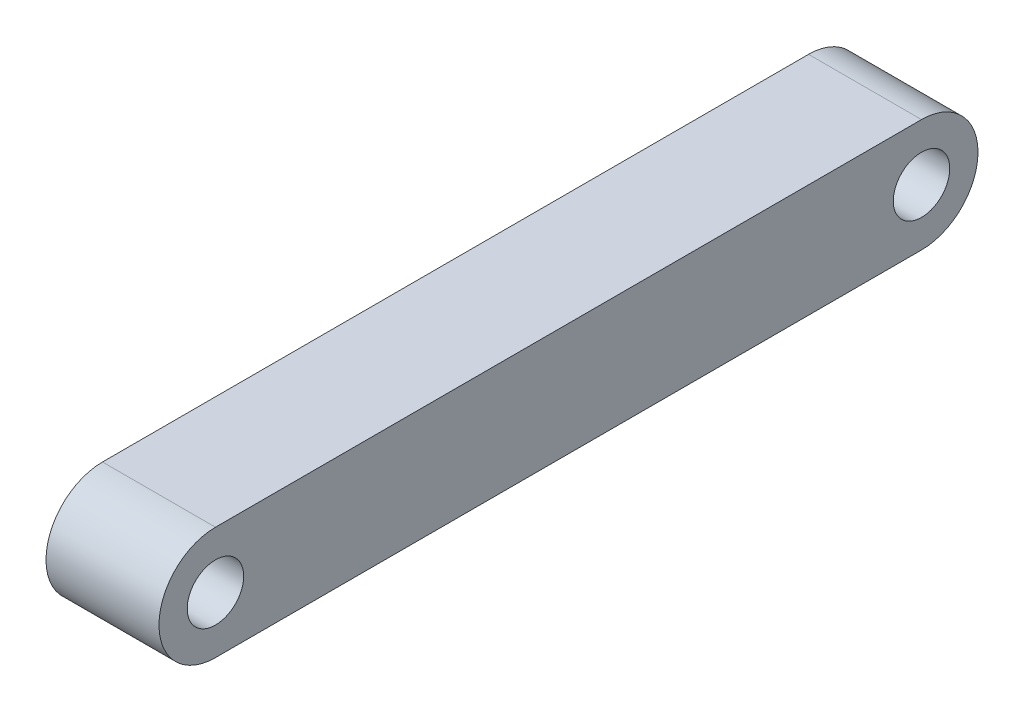
ISO-10303-21;
HEADER;
FILE_DESCRIPTION(('STEP AP214'),'2;1');
FILE_NAME('part.step','',(''),(''),'','','');
FILE_SCHEMA(('AUTOMOTIVE_DESIGN { 1 0 10303 214 1 1 1 1 }'));
ENDSEC;
DATA;
#1=APPLICATION_CONTEXT('core data for automotive mechanical design processes');
#2=APPLICATION_PROTOCOL_DEFINITION('international standard','automotive_design',2000,#1);
#3=PRODUCT_CONTEXT('',#1,'mechanical');
#4=PRODUCT('Part','Part','',(#3));
#5=PRODUCT_RELATED_PRODUCT_CATEGORY('part','',(#4));
#6=PRODUCT_DEFINITION_FORMATION('','',#4);
#7=PRODUCT_DEFINITION_CONTEXT('part definition',#1,'design');
#8=PRODUCT_DEFINITION('design','',#6,#7);
#9=PRODUCT_DEFINITION_SHAPE('','',#8);
#10=(LENGTH_UNIT() NAMED_UNIT(*) SI_UNIT(.MILLI.,.METRE.));
#11=(NAMED_UNIT(*) PLANE_ANGLE_UNIT() SI_UNIT($,.RADIAN.));
#12=(NAMED_UNIT(*) SI_UNIT($,.STERADIAN.) SOLID_ANGLE_UNIT());
#13=UNCERTAINTY_MEASURE_WITH_UNIT(LENGTH_MEASURE(1.E-05),#10,'distance_accuracy_value','');
#14=(GEOMETRIC_REPRESENTATION_CONTEXT(3) GLOBAL_UNCERTAINTY_ASSIGNED_CONTEXT((#13)) GLOBAL_UNIT_ASSIGNED_CONTEXT((#10,
#11,#12)) REPRESENTATION_CONTEXT('',''));
#15=CARTESIAN_POINT('',(0.,0.,0.));
#16=DIRECTION('',(0.,0.,1.));
#17=DIRECTION('',(1.,0.,0.));
#18=AXIS2_PLACEMENT_3D('',#15,#16,#17);
#19=CARTESIAN_POINT('',(20.,0.,-250.));
#20=DIRECTION('',(-1.,0.,0.));
#21=DIRECTION('',(0.,0.,1.));
#22=AXIS2_PLACEMENT_3D('',#19,#20,#21);
#23=CYLINDRICAL_SURFACE('',#22,20.);
#24=CARTESIAN_POINT('',(-20.,0.,-250.));
#25=DIRECTION('',(1.,0.,0.));
#26=DIRECTION('',(0.,0.,-1.));
#27=AXIS2_PLACEMENT_3D('',#24,#25,#26);
#28=CIRCLE('',#27,20.);
#29=CARTESIAN_POINT('',(-20.,-20.,-250.));
#30=VERTEX_POINT('',#29);
#31=CARTESIAN_POINT('',(-20.,20.,-250.));
#32=VERTEX_POINT('',#31);
#33=EDGE_CURVE('E115',#30,#32,#28,.T.);
#34=ORIENTED_EDGE('',*,*,#33,.T.);
#35=DIRECTION('',(-1.,0.,0.));
#36=VECTOR('',#35,1.);
#37=CARTESIAN_POINT('',(20.,20.,-250.));
#38=LINE('',#37,#36);
#39=CARTESIAN_POINT('',(20.,20.,-250.));
#40=VERTEX_POINT('',#39);
#41=EDGE_CURVE('E11',#40,#32,#38,.T.);
#42=ORIENTED_EDGE('',*,*,#41,.F.);
#43=CARTESIAN_POINT('',(20.,0.,-250.));
#44=DIRECTION('',(1.,0.,0.));
#45=DIRECTION('',(0.,0.,-1.));
#46=AXIS2_PLACEMENT_3D('',#43,#44,#45);
#47=CIRCLE('',#46,20.);
#48=CARTESIAN_POINT('',(20.,-20.,-250.));
#49=VERTEX_POINT('',#48);
#50=EDGE_CURVE('E81',#49,#40,#47,.T.);
#51=ORIENTED_EDGE('',*,*,#50,.F.);
#52=DIRECTION('',(-1.,0.,0.));
#53=VECTOR('',#52,1.);
#54=CARTESIAN_POINT('',(20.,-20.,-250.));
#55=LINE('',#54,#53);
#56=EDGE_CURVE('E112',#49,#30,#55,.T.);
#57=ORIENTED_EDGE('',*,*,#56,.T.);
#58=EDGE_LOOP('',(#34,#42,#51,#57));
#59=FACE_BOUND('',#58,.T.);
#60=ADVANCED_FACE('F41',(#59),#23,.T.);
#61=CARTESIAN_POINT('',(20.,20.,0.));
#62=DIRECTION('',(0.,1.,0.));
#63=DIRECTION('',(0.,0.,1.));
#64=AXIS2_PLACEMENT_3D('',#61,#62,#63);
#65=PLANE('',#64);
#66=DIRECTION('',(0.,0.,-1.));
#67=VECTOR('',#66,1.);
#68=CARTESIAN_POINT('',(-20.,20.,0.));
#69=LINE('',#68,#67);
#70=CARTESIAN_POINT('',(-20.,20.,0.));
#71=VERTEX_POINT('',#70);
#72=EDGE_CURVE('E93',#71,#32,#69,.T.);
#73=ORIENTED_EDGE('',*,*,#72,.F.);
#74=DIRECTION('',(-1.,0.,0.));
#75=VECTOR('',#74,1.);
#76=CARTESIAN_POINT('',(20.,20.,0.));
#77=LINE('',#76,#75);
#78=CARTESIAN_POINT('',(20.,20.,0.));
#79=VERTEX_POINT('',#78);
#80=EDGE_CURVE('E47',#79,#71,#77,.T.);
#81=ORIENTED_EDGE('',*,*,#80,.F.);
#82=DIRECTION('',(0.,0.,-1.));
#83=VECTOR('',#82,1.);
#84=CARTESIAN_POINT('',(20.,20.,0.));
#85=LINE('',#84,#83);
#86=EDGE_CURVE('E91',#79,#40,#85,.T.);
#87=ORIENTED_EDGE('',*,*,#86,.T.);
#88=ORIENTED_EDGE('',*,*,#41,.T.);
#89=EDGE_LOOP('',(#73,#81,#87,#88));
#90=FACE_BOUND('',#89,.T.);
#91=ADVANCED_FACE('F89',(#90),#65,.T.);
#92=CARTESIAN_POINT('',(20.,0.,0.));
#93=DIRECTION('',(-1.,0.,0.));
#94=DIRECTION('',(0.,0.,1.));
#95=AXIS2_PLACEMENT_3D('',#92,#93,#94);
#96=CYLINDRICAL_SURFACE('',#95,20.);
#97=CARTESIAN_POINT('',(-20.,0.,0.));
#98=DIRECTION('',(1.,0.,0.));
#99=DIRECTION('',(0.,0.,-1.));
#100=AXIS2_PLACEMENT_3D('',#97,#98,#99);
#101=CIRCLE('',#100,20.);
#102=CARTESIAN_POINT('',(-20.,-20.,0.));
#103=VERTEX_POINT('',#102);
#104=EDGE_CURVE('E74',#71,#103,#101,.T.);
#105=ORIENTED_EDGE('',*,*,#104,.T.);
#106=DIRECTION('',(-1.,0.,0.));
#107=VECTOR('',#106,1.);
#108=CARTESIAN_POINT('',(20.,-20.,0.));
#109=LINE('',#108,#107);
#110=CARTESIAN_POINT('',(20.,-20.,0.));
#111=VERTEX_POINT('',#110);
#112=EDGE_CURVE('E92',#111,#103,#109,.T.);
#113=ORIENTED_EDGE('',*,*,#112,.F.);
#114=CARTESIAN_POINT('',(20.,0.,0.));
#115=DIRECTION('',(1.,0.,0.));
#116=DIRECTION('',(0.,0.,-1.));
#117=AXIS2_PLACEMENT_3D('',#114,#115,#116);
#118=CIRCLE('',#117,20.);
#119=EDGE_CURVE('E94',#79,#111,#118,.T.);
#120=ORIENTED_EDGE('',*,*,#119,.F.);
#121=ORIENTED_EDGE('',*,*,#80,.T.);
#122=EDGE_LOOP('',(#105,#113,#120,#121));
#123=FACE_BOUND('',#122,.T.);
#124=ADVANCED_FACE('F96',(#123),#96,.T.);
#125=CARTESIAN_POINT('',(20.,0.,0.));
#126=DIRECTION('',(-1.,0.,0.));
#127=DIRECTION('',(0.,0.,1.));
#128=AXIS2_PLACEMENT_3D('',#125,#126,#127);
#129=CYLINDRICAL_SURFACE('',#128,10.);
#130=CARTESIAN_POINT('',(20.,0.,0.));
#131=DIRECTION('',(1.,0.,0.));
#132=DIRECTION('',(0.,0.,-1.));
#133=AXIS2_PLACEMENT_3D('',#130,#131,#132);
#134=CIRCLE('',#133,10.);
#135=CARTESIAN_POINT('',(20.,0.,-10.));
#136=VERTEX_POINT('',#135);
#137=EDGE_CURVE('E103',#136,#136,#134,.T.);
#138=ORIENTED_EDGE('',*,*,#137,.T.);
#139=EDGE_LOOP('',(#138));
#140=FACE_BOUND('',#139,.T.);
#141=CARTESIAN_POINT('',(-20.,0.,0.));
#142=DIRECTION('',(1.,0.,0.));
#143=DIRECTION('',(0.,0.,-1.));
#144=AXIS2_PLACEMENT_3D('',#141,#142,#143);
#145=CIRCLE('',#144,10.);
#146=CARTESIAN_POINT('',(-20.,0.,-10.));
#147=VERTEX_POINT('',#146);
#148=EDGE_CURVE('E120',#147,#147,#145,.T.);
#149=ORIENTED_EDGE('',*,*,#148,.F.);
#150=EDGE_LOOP('',(#149));
#151=FACE_BOUND('',#150,.T.);
#152=ADVANCED_FACE('F140',(#140,#151),#129,.F.);
#153=CARTESIAN_POINT('',(20.,-20.,0.));
#154=DIRECTION('',(0.,1.,0.));
#155=DIRECTION('',(0.,0.,1.));
#156=AXIS2_PLACEMENT_3D('',#153,#154,#155);
#157=PLANE('',#156);
#158=DIRECTION('',(0.,0.,-1.));
#159=VECTOR('',#158,1.);
#160=CARTESIAN_POINT('',(-20.,-20.,0.));
#161=LINE('',#160,#159);
#162=EDGE_CURVE('E76',#103,#30,#161,.T.);
#163=ORIENTED_EDGE('',*,*,#162,.T.);
#164=ORIENTED_EDGE('',*,*,#56,.F.);
#165=DIRECTION('',(0.,0.,-1.));
#166=VECTOR('',#165,1.);
#167=CARTESIAN_POINT('',(20.,-20.,0.));
#168=LINE('',#167,#166);
#169=EDGE_CURVE('E60',#111,#49,#168,.T.);
#170=ORIENTED_EDGE('',*,*,#169,.F.);
#171=ORIENTED_EDGE('',*,*,#112,.T.);
#172=EDGE_LOOP('',(#163,#164,#170,#171));
#173=FACE_BOUND('',#172,.T.);
#174=ADVANCED_FACE('F125',(#173),#157,.F.);
#175=CARTESIAN_POINT('',(20.,0.,-250.));
#176=DIRECTION('',(-1.,0.,0.));
#177=DIRECTION('',(0.,0.,1.));
#178=AXIS2_PLACEMENT_3D('',#175,#176,#177);
#179=CYLINDRICAL_SURFACE('',#178,9.99999999999998);
#180=CARTESIAN_POINT('',(20.,0.,-250.));
#181=DIRECTION('',(1.,0.,0.));
#182=DIRECTION('',(0.,0.,-1.));
#183=AXIS2_PLACEMENT_3D('',#180,#181,#182);
#184=CIRCLE('',#183,9.99999999999998);
#185=CARTESIAN_POINT('',(20.,0.,-260.));
#186=VERTEX_POINT('',#185);
#187=EDGE_CURVE('E110',#186,#186,#184,.T.);
#188=ORIENTED_EDGE('',*,*,#187,.T.);
#189=EDGE_LOOP('',(#188));
#190=FACE_BOUND('',#189,.T.);
#191=CARTESIAN_POINT('',(-20.,0.,-250.));
#192=DIRECTION('',(1.,0.,0.));
#193=DIRECTION('',(0.,0.,-1.));
#194=AXIS2_PLACEMENT_3D('',#191,#192,#193);
#195=CIRCLE('',#194,9.99999999999998);
#196=CARTESIAN_POINT('',(-20.,0.,-260.));
#197=VERTEX_POINT('',#196);
#198=EDGE_CURVE('E102',#197,#197,#195,.T.);
#199=ORIENTED_EDGE('',*,*,#198,.F.);
#200=EDGE_LOOP('',(#199));
#201=FACE_BOUND('',#200,.T.);
#202=ADVANCED_FACE('F145',(#190,#201),#179,.F.);
#203=CARTESIAN_POINT('',(20.,0.,0.));
#204=DIRECTION('',(1.,0.,0.));
#205=DIRECTION('',(0.,0.,-1.));
#206=AXIS2_PLACEMENT_3D('',#203,#204,#205);
#207=PLANE('',#206);
#208=ORIENTED_EDGE('',*,*,#50,.T.);
#209=ORIENTED_EDGE('',*,*,#86,.F.);
#210=ORIENTED_EDGE('',*,*,#119,.T.);
#211=ORIENTED_EDGE('',*,*,#169,.T.);
#212=EDGE_LOOP('',(#208,#209,#210,#211));
#213=FACE_BOUND('',#212,.T.);
#214=ORIENTED_EDGE('',*,*,#137,.F.);
#215=EDGE_LOOP('',(#214));
#216=FACE_BOUND('',#215,.T.);
#217=ORIENTED_EDGE('',*,*,#187,.F.);
#218=EDGE_LOOP('',(#217));
#219=FACE_BOUND('',#218,.T.);
#220=ADVANCED_FACE('F97',(#213,#216,#219),#207,.T.);
#221=CARTESIAN_POINT('',(-20.,0.,0.));
#222=DIRECTION('',(1.,0.,0.));
#223=DIRECTION('',(0.,0.,-1.));
#224=AXIS2_PLACEMENT_3D('',#221,#222,#223);
#225=PLANE('',#224);
#226=ORIENTED_EDGE('',*,*,#33,.F.);
#227=ORIENTED_EDGE('',*,*,#162,.F.);
#228=ORIENTED_EDGE('',*,*,#104,.F.);
#229=ORIENTED_EDGE('',*,*,#72,.T.);
#230=EDGE_LOOP('',(#226,#227,#228,#229));
#231=FACE_BOUND('',#230,.T.);
#232=ORIENTED_EDGE('',*,*,#148,.T.);
#233=EDGE_LOOP('',(#232));
#234=FACE_BOUND('',#233,.T.);
#235=ORIENTED_EDGE('',*,*,#198,.T.);
#236=EDGE_LOOP('',(#235));
#237=FACE_BOUND('',#236,.T.);
#238=ADVANCED_FACE('F130',(#231,#234,#237),#225,.F.);
#239=CLOSED_SHELL('',(#60,#91,#124,#152,#174,#202,#220,#238));
#240=MANIFOLD_SOLID_BREP('B2',#239);
#241=ADVANCED_BREP_SHAPE_REPRESENTATION('',(#18,#240),#14);
#242=SHAPE_DEFINITION_REPRESENTATION(#9,#241);
ENDSEC;
END-ISO-10303-21;
